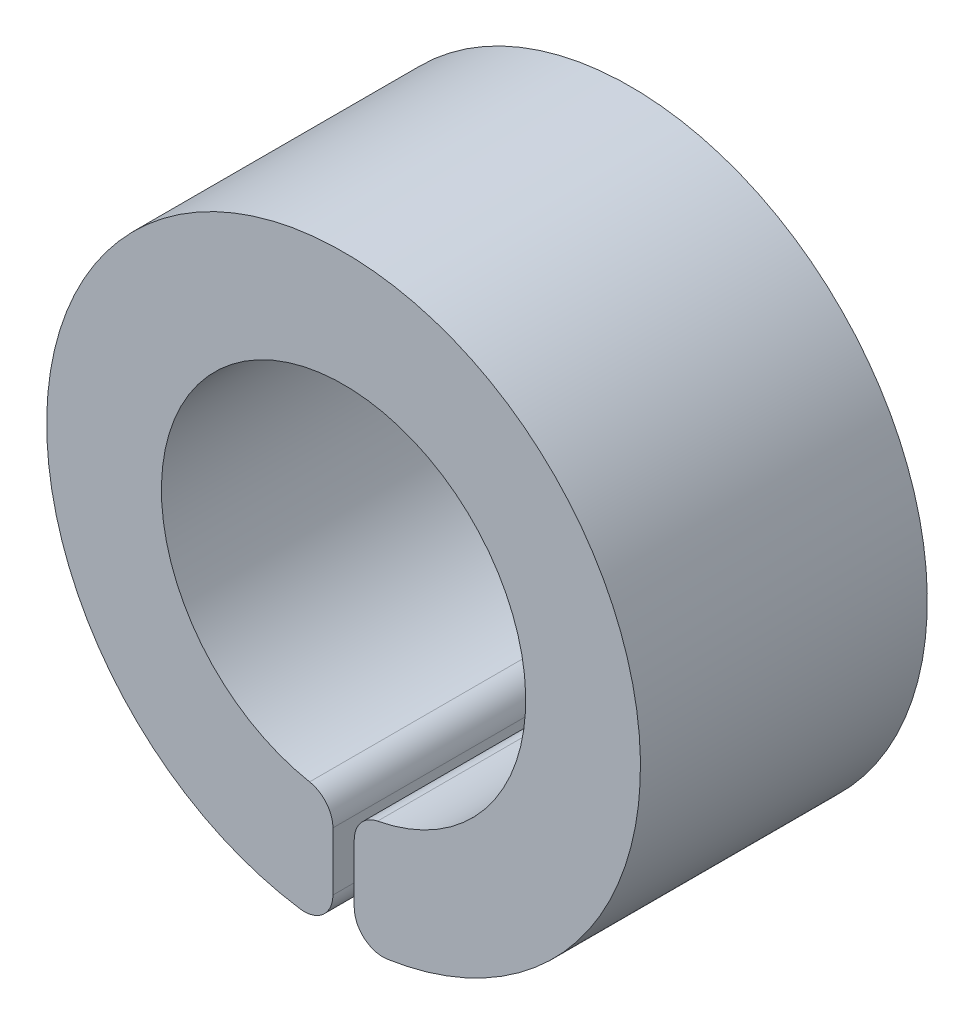
ISO-10303-21;
HEADER;
FILE_DESCRIPTION(('STEP AP214'),'2;1');
FILE_NAME('part.step','',(''),(''),'','','');
FILE_SCHEMA(('AUTOMOTIVE_DESIGN { 1 0 10303 214 1 1 1 1 }'));
ENDSEC;
DATA;
#1=APPLICATION_CONTEXT('core data for automotive mechanical design processes');
#2=APPLICATION_PROTOCOL_DEFINITION('international standard','automotive_design',2000,#1);
#3=PRODUCT_CONTEXT('',#1,'mechanical');
#4=PRODUCT('Part','Part','',(#3));
#5=PRODUCT_RELATED_PRODUCT_CATEGORY('part','',(#4));
#6=PRODUCT_DEFINITION_FORMATION('','',#4);
#7=PRODUCT_DEFINITION_CONTEXT('part definition',#1,'design');
#8=PRODUCT_DEFINITION('design','',#6,#7);
#9=PRODUCT_DEFINITION_SHAPE('','',#8);
#10=(LENGTH_UNIT() NAMED_UNIT(*) SI_UNIT(.MILLI.,.METRE.));
#11=(NAMED_UNIT(*) PLANE_ANGLE_UNIT() SI_UNIT($,.RADIAN.));
#12=(NAMED_UNIT(*) SI_UNIT($,.STERADIAN.) SOLID_ANGLE_UNIT());
#13=UNCERTAINTY_MEASURE_WITH_UNIT(LENGTH_MEASURE(1.E-05),#10,'distance_accuracy_value','');
#14=(GEOMETRIC_REPRESENTATION_CONTEXT(3) GLOBAL_UNCERTAINTY_ASSIGNED_CONTEXT((#13)) GLOBAL_UNIT_ASSIGNED_CONTEXT((#10,
#11,#12)) REPRESENTATION_CONTEXT('',''));
#15=CARTESIAN_POINT('',(0.,0.,0.));
#16=DIRECTION('',(0.,0.,1.));
#17=DIRECTION('',(1.,0.,0.));
#18=AXIS2_PLACEMENT_3D('',#15,#16,#17);
#19=CARTESIAN_POINT('',(0.,0.,5.));
#20=DIRECTION('',(0.,0.,1.));
#21=DIRECTION('',(1.,0.,0.));
#22=AXIS2_PLACEMENT_3D('',#19,#20,#21);
#23=PLANE('',#22);
#24=DIRECTION('',(0.,1.,0.));
#25=VECTOR('',#24,1.);
#26=CARTESIAN_POINT('',(0.185585610970255,-20.,5.));
#27=LINE('',#26,#25);
#28=CARTESIAN_POINT('',(0.185585610970255,-4.62445644049445,5.));
#29=VERTEX_POINT('',#28);
#30=CARTESIAN_POINT('',(0.185585610970255,-3.61048436778648,5.));
#31=VERTEX_POINT('',#30);
#32=EDGE_CURVE('E164',#29,#31,#27,.T.);
#33=ORIENTED_EDGE('',*,*,#32,.F.);
#34=CARTESIAN_POINT('',(0.685585610970255,-4.62445644049444,5.));
#35=DIRECTION('',(0.,0.,1.));
#36=DIRECTION('',(1.,0.,0.));
#37=AXIS2_PLACEMENT_3D('',#34,#35,#36);
#38=CIRCLE('',#37,0.5);
#39=CARTESIAN_POINT('',(0.758910275245148,-5.11905071220508,5.));
#40=VERTEX_POINT('',#39);
#41=EDGE_CURVE('E148',#29,#40,#38,.T.);
#42=ORIENTED_EDGE('',*,*,#41,.T.);
#43=CARTESIAN_POINT('',(0.,0.,5.));
#44=DIRECTION('',(0.,0.,1.));
#45=DIRECTION('',(1.,0.,0.));
#46=AXIS2_PLACEMENT_3D('',#43,#44,#45);
#47=CIRCLE('',#46,5.175);
#48=CARTESIAN_POINT('',(-0.758910275245148,-5.11905071220508,5.));
#49=VERTEX_POINT('',#48);
#50=EDGE_CURVE('E121',#40,#49,#47,.T.);
#51=ORIENTED_EDGE('',*,*,#50,.T.);
#52=CARTESIAN_POINT('',(-0.685585610970255,-4.62445644049444,5.));
#53=DIRECTION('',(0.,0.,1.));
#54=DIRECTION('',(1.,0.,0.));
#55=AXIS2_PLACEMENT_3D('',#52,#53,#54);
#56=CIRCLE('',#55,0.5);
#57=CARTESIAN_POINT('',(-0.185585610970255,-4.62445644049445,5.));
#58=VERTEX_POINT('',#57);
#59=EDGE_CURVE('E144',#49,#58,#56,.T.);
#60=ORIENTED_EDGE('',*,*,#59,.T.);
#61=DIRECTION('',(0.,1.,0.));
#62=VECTOR('',#61,1.);
#63=CARTESIAN_POINT('',(-0.185585610970255,-20.,5.));
#64=LINE('',#63,#62);
#65=CARTESIAN_POINT('',(-0.185585610970255,-3.61048436778648,5.));
#66=VERTEX_POINT('',#65);
#67=EDGE_CURVE('E158',#58,#66,#64,.T.);
#68=ORIENTED_EDGE('',*,*,#67,.T.);
#69=CARTESIAN_POINT('',(-0.685585610970255,-3.61048436778648,5.));
#70=DIRECTION('',(0.,0.,1.));
#71=DIRECTION('',(1.,0.,0.));
#72=AXIS2_PLACEMENT_3D('',#69,#70,#71);
#73=CIRCLE('',#72,0.5);
#74=CARTESIAN_POINT('',(-0.592308657096751,-3.11926200482233,5.));
#75=VERTEX_POINT('',#74);
#76=EDGE_CURVE('E50',#66,#75,#73,.T.);
#77=ORIENTED_EDGE('',*,*,#76,.T.);
#78=CARTESIAN_POINT('',(0.,0.,5.));
#79=DIRECTION('',(0.,0.,1.));
#80=DIRECTION('',(1.,0.,0.));
#81=AXIS2_PLACEMENT_3D('',#78,#79,#80);
#82=CIRCLE('',#81,3.175);
#83=CARTESIAN_POINT('',(0.592308657096751,-3.11926200482233,5.));
#84=VERTEX_POINT('',#83);
#85=EDGE_CURVE('E129',#84,#75,#82,.T.);
#86=ORIENTED_EDGE('',*,*,#85,.F.);
#87=CARTESIAN_POINT('',(0.685585610970255,-3.61048436778648,5.));
#88=DIRECTION('',(0.,0.,1.));
#89=DIRECTION('',(1.,0.,0.));
#90=AXIS2_PLACEMENT_3D('',#87,#88,#89);
#91=CIRCLE('',#90,0.5);
#92=EDGE_CURVE('E146',#84,#31,#91,.T.);
#93=ORIENTED_EDGE('',*,*,#92,.T.);
#94=EDGE_LOOP('',(#33,#42,#51,#60,#68,#77,#86,#93));
#95=FACE_BOUND('',#94,.T.);
#96=ADVANCED_FACE('F35',(#95),#23,.T.);
#97=CARTESIAN_POINT('',(0.,0.,0.));
#98=DIRECTION('',(0.,0.,1.));
#99=DIRECTION('',(1.,0.,0.));
#100=AXIS2_PLACEMENT_3D('',#97,#98,#99);
#101=PLANE('',#100);
#102=CARTESIAN_POINT('',(0.,0.,0.));
#103=DIRECTION('',(0.,0.,1.));
#104=DIRECTION('',(1.,0.,0.));
#105=AXIS2_PLACEMENT_3D('',#102,#103,#104);
#106=CIRCLE('',#105,5.175);
#107=CARTESIAN_POINT('',(0.758910275245148,-5.11905071220508,0.));
#108=VERTEX_POINT('',#107);
#109=CARTESIAN_POINT('',(-0.758910275245148,-5.11905071220508,0.));
#110=VERTEX_POINT('',#109);
#111=EDGE_CURVE('E118',#108,#110,#106,.T.);
#112=ORIENTED_EDGE('',*,*,#111,.F.);
#113=CARTESIAN_POINT('',(0.685585610970255,-4.62445644049444,0.));
#114=DIRECTION('',(0.,0.,1.));
#115=DIRECTION('',(1.,0.,0.));
#116=AXIS2_PLACEMENT_3D('',#113,#114,#115);
#117=CIRCLE('',#116,0.5);
#118=CARTESIAN_POINT('',(0.185585610970255,-4.62445644049445,0.));
#119=VERTEX_POINT('',#118);
#120=EDGE_CURVE('E100',#108,#119,#117,.F.);
#121=ORIENTED_EDGE('',*,*,#120,.T.);
#122=DIRECTION('',(0.,1.,0.));
#123=VECTOR('',#122,1.);
#124=CARTESIAN_POINT('',(0.185585610970255,-20.,0.));
#125=LINE('',#124,#123);
#126=CARTESIAN_POINT('',(0.185585610970255,-3.61048436778648,0.));
#127=VERTEX_POINT('',#126);
#128=EDGE_CURVE('E167',#119,#127,#125,.T.);
#129=ORIENTED_EDGE('',*,*,#128,.T.);
#130=CARTESIAN_POINT('',(0.685585610970255,-3.61048436778648,0.));
#131=DIRECTION('',(0.,0.,1.));
#132=DIRECTION('',(1.,0.,0.));
#133=AXIS2_PLACEMENT_3D('',#130,#131,#132);
#134=CIRCLE('',#133,0.5);
#135=CARTESIAN_POINT('',(0.592308657096751,-3.11926200482233,0.));
#136=VERTEX_POINT('',#135);
#137=EDGE_CURVE('E111',#127,#136,#134,.F.);
#138=ORIENTED_EDGE('',*,*,#137,.T.);
#139=CARTESIAN_POINT('',(0.,0.,0.));
#140=DIRECTION('',(0.,0.,1.));
#141=DIRECTION('',(1.,0.,0.));
#142=AXIS2_PLACEMENT_3D('',#139,#140,#141);
#143=CIRCLE('',#142,3.175);
#144=CARTESIAN_POINT('',(-0.592308657096751,-3.11926200482233,0.));
#145=VERTEX_POINT('',#144);
#146=EDGE_CURVE('E132',#136,#145,#143,.T.);
#147=ORIENTED_EDGE('',*,*,#146,.T.);
#148=CARTESIAN_POINT('',(-0.685585610970255,-3.61048436778648,0.));
#149=DIRECTION('',(0.,0.,1.));
#150=DIRECTION('',(1.,0.,0.));
#151=AXIS2_PLACEMENT_3D('',#148,#149,#150);
#152=CIRCLE('',#151,0.5);
#153=CARTESIAN_POINT('',(-0.185585610970255,-3.61048436778648,0.));
#154=VERTEX_POINT('',#153);
#155=EDGE_CURVE('E122',#145,#154,#152,.F.);
#156=ORIENTED_EDGE('',*,*,#155,.T.);
#157=DIRECTION('',(0.,1.,0.));
#158=VECTOR('',#157,1.);
#159=CARTESIAN_POINT('',(-0.185585610970255,-20.,0.));
#160=LINE('',#159,#158);
#161=CARTESIAN_POINT('',(-0.185585610970255,-4.62445644049445,0.));
#162=VERTEX_POINT('',#161);
#163=EDGE_CURVE('E160',#162,#154,#160,.T.);
#164=ORIENTED_EDGE('',*,*,#163,.F.);
#165=CARTESIAN_POINT('',(-0.685585610970255,-4.62445644049444,0.));
#166=DIRECTION('',(0.,0.,1.));
#167=DIRECTION('',(1.,0.,0.));
#168=AXIS2_PLACEMENT_3D('',#165,#166,#167);
#169=CIRCLE('',#168,0.5);
#170=EDGE_CURVE('E128',#162,#110,#169,.F.);
#171=ORIENTED_EDGE('',*,*,#170,.T.);
#172=EDGE_LOOP('',(#112,#121,#129,#138,#147,#156,#164,#171));
#173=FACE_BOUND('',#172,.T.);
#174=ADVANCED_FACE('F125',(#173),#101,.F.);
#175=CARTESIAN_POINT('',(0.,0.,5.));
#176=DIRECTION('',(0.,0.,-1.));
#177=DIRECTION('',(-1.,0.,0.));
#178=AXIS2_PLACEMENT_3D('',#175,#176,#177);
#179=CYLINDRICAL_SURFACE('',#178,5.175);
#180=ORIENTED_EDGE('',*,*,#50,.F.);
#181=DIRECTION('',(0.,0.,-1.));
#182=VECTOR('',#181,1.);
#183=CARTESIAN_POINT('',(0.758910275245148,-5.11905071220508,5.));
#184=LINE('',#183,#182);
#185=EDGE_CURVE('E104',#40,#108,#184,.T.);
#186=ORIENTED_EDGE('',*,*,#185,.T.);
#187=ORIENTED_EDGE('',*,*,#111,.T.);
#188=DIRECTION('',(0.,0.,-1.));
#189=VECTOR('',#188,1.);
#190=CARTESIAN_POINT('',(-0.758910275245148,-5.11905071220508,5.));
#191=LINE('',#190,#189);
#192=EDGE_CURVE('E123',#110,#49,#191,.F.);
#193=ORIENTED_EDGE('',*,*,#192,.T.);
#194=EDGE_LOOP('',(#180,#186,#187,#193));
#195=FACE_BOUND('',#194,.T.);
#196=ADVANCED_FACE('F116',(#195),#179,.T.);
#197=CARTESIAN_POINT('',(0.,0.,5.));
#198=DIRECTION('',(0.,0.,-1.));
#199=DIRECTION('',(-1.,0.,0.));
#200=AXIS2_PLACEMENT_3D('',#197,#198,#199);
#201=CYLINDRICAL_SURFACE('',#200,3.175);
#202=ORIENTED_EDGE('',*,*,#146,.F.);
#203=DIRECTION('',(0.,0.,-1.));
#204=VECTOR('',#203,1.);
#205=CARTESIAN_POINT('',(0.592308657096751,-3.11926200482233,5.));
#206=LINE('',#205,#204);
#207=EDGE_CURVE('E57',#136,#84,#206,.F.);
#208=ORIENTED_EDGE('',*,*,#207,.T.);
#209=ORIENTED_EDGE('',*,*,#85,.T.);
#210=DIRECTION('',(0.,0.,-1.));
#211=VECTOR('',#210,1.);
#212=CARTESIAN_POINT('',(-0.592308657096751,-3.11926200482233,5.));
#213=LINE('',#212,#211);
#214=EDGE_CURVE('E150',#75,#145,#213,.T.);
#215=ORIENTED_EDGE('',*,*,#214,.T.);
#216=EDGE_LOOP('',(#202,#208,#209,#215));
#217=FACE_BOUND('',#216,.T.);
#218=ADVANCED_FACE('F179',(#217),#201,.F.);
#219=CARTESIAN_POINT('',(0.185585610970255,-20.,0.));
#220=DIRECTION('',(1.,0.,0.));
#221=DIRECTION('',(0.,0.,-1.));
#222=AXIS2_PLACEMENT_3D('',#219,#220,#221);
#223=PLANE('',#222);
#224=ORIENTED_EDGE('',*,*,#128,.F.);
#225=DIRECTION('',(0.,0.,-1.));
#226=VECTOR('',#225,1.);
#227=CARTESIAN_POINT('',(0.185585610970255,-4.62445644049445,0.));
#228=LINE('',#227,#226);
#229=EDGE_CURVE('E105',#119,#29,#228,.F.);
#230=ORIENTED_EDGE('',*,*,#229,.T.);
#231=ORIENTED_EDGE('',*,*,#32,.T.);
#232=DIRECTION('',(0.,0.,1.));
#233=VECTOR('',#232,1.);
#234=CARTESIAN_POINT('',(0.185585610970255,-3.61048436778648,0.));
#235=LINE('',#234,#233);
#236=EDGE_CURVE('E110',#31,#127,#235,.F.);
#237=ORIENTED_EDGE('',*,*,#236,.T.);
#238=EDGE_LOOP('',(#224,#230,#231,#237));
#239=FACE_BOUND('',#238,.T.);
#240=ADVANCED_FACE('F173',(#239),#223,.F.);
#241=CARTESIAN_POINT('',(-0.185585610970255,-20.,0.));
#242=DIRECTION('',(-1.,0.,0.));
#243=DIRECTION('',(0.,0.,1.));
#244=AXIS2_PLACEMENT_3D('',#241,#242,#243);
#245=PLANE('',#244);
#246=ORIENTED_EDGE('',*,*,#67,.F.);
#247=DIRECTION('',(0.,0.,-1.));
#248=VECTOR('',#247,1.);
#249=CARTESIAN_POINT('',(-0.185585610970255,-4.62445644049445,0.));
#250=LINE('',#249,#248);
#251=EDGE_CURVE('E11',#58,#162,#250,.T.);
#252=ORIENTED_EDGE('',*,*,#251,.T.);
#253=ORIENTED_EDGE('',*,*,#163,.T.);
#254=DIRECTION('',(0.,0.,1.));
#255=VECTOR('',#254,1.);
#256=CARTESIAN_POINT('',(-0.185585610970255,-3.61048436778648,5.));
#257=LINE('',#256,#255);
#258=EDGE_CURVE('E43',#154,#66,#257,.T.);
#259=ORIENTED_EDGE('',*,*,#258,.T.);
#260=EDGE_LOOP('',(#246,#252,#253,#259));
#261=FACE_BOUND('',#260,.T.);
#262=ADVANCED_FACE('F157',(#261),#245,.F.);
#263=CARTESIAN_POINT('',(0.685585610970255,-4.62445644049444,5.));
#264=DIRECTION('',(0.,0.,-1.));
#265=DIRECTION('',(-1.,0.,0.));
#266=AXIS2_PLACEMENT_3D('',#263,#264,#265);
#267=CYLINDRICAL_SURFACE('',#266,0.5);
#268=ORIENTED_EDGE('',*,*,#41,.F.);
#269=ORIENTED_EDGE('',*,*,#229,.F.);
#270=ORIENTED_EDGE('',*,*,#120,.F.);
#271=ORIENTED_EDGE('',*,*,#185,.F.);
#272=EDGE_LOOP('',(#268,#269,#270,#271));
#273=FACE_BOUND('',#272,.T.);
#274=ADVANCED_FACE('F103',(#273),#267,.T.);
#275=CARTESIAN_POINT('',(0.685585610970255,-3.61048436778648,5.));
#276=DIRECTION('',(0.,0.,-1.));
#277=DIRECTION('',(-1.,0.,0.));
#278=AXIS2_PLACEMENT_3D('',#275,#276,#277);
#279=CYLINDRICAL_SURFACE('',#278,0.5);
#280=ORIENTED_EDGE('',*,*,#92,.F.);
#281=ORIENTED_EDGE('',*,*,#207,.F.);
#282=ORIENTED_EDGE('',*,*,#137,.F.);
#283=ORIENTED_EDGE('',*,*,#236,.F.);
#284=EDGE_LOOP('',(#280,#281,#282,#283));
#285=FACE_BOUND('',#284,.T.);
#286=ADVANCED_FACE('F177',(#285),#279,.T.);
#287=CARTESIAN_POINT('',(-0.685585610970255,-4.62445644049444,5.));
#288=DIRECTION('',(0.,0.,-1.));
#289=DIRECTION('',(-1.,0.,0.));
#290=AXIS2_PLACEMENT_3D('',#287,#288,#289);
#291=CYLINDRICAL_SURFACE('',#290,0.5);
#292=ORIENTED_EDGE('',*,*,#170,.F.);
#293=ORIENTED_EDGE('',*,*,#251,.F.);
#294=ORIENTED_EDGE('',*,*,#59,.F.);
#295=ORIENTED_EDGE('',*,*,#192,.F.);
#296=EDGE_LOOP('',(#292,#293,#294,#295));
#297=FACE_BOUND('',#296,.T.);
#298=ADVANCED_FACE('F181',(#297),#291,.T.);
#299=CARTESIAN_POINT('',(-0.685585610970255,-3.61048436778648,5.));
#300=DIRECTION('',(0.,0.,-1.));
#301=DIRECTION('',(-1.,0.,0.));
#302=AXIS2_PLACEMENT_3D('',#299,#300,#301);
#303=CYLINDRICAL_SURFACE('',#302,0.5);
#304=ORIENTED_EDGE('',*,*,#155,.F.);
#305=ORIENTED_EDGE('',*,*,#214,.F.);
#306=ORIENTED_EDGE('',*,*,#76,.F.);
#307=ORIENTED_EDGE('',*,*,#258,.F.);
#308=EDGE_LOOP('',(#304,#305,#306,#307));
#309=FACE_BOUND('',#308,.T.);
#310=ADVANCED_FACE('F37',(#309),#303,.T.);
#311=CLOSED_SHELL('',(#96,#174,#196,#218,#240,#262,#274,#286,#298,#310));
#312=MANIFOLD_SOLID_BREP('B2',#311);
#313=ADVANCED_BREP_SHAPE_REPRESENTATION('',(#18,#312),#14);
#314=SHAPE_DEFINITION_REPRESENTATION(#9,#313);
ENDSEC;
END-ISO-10303-21;
